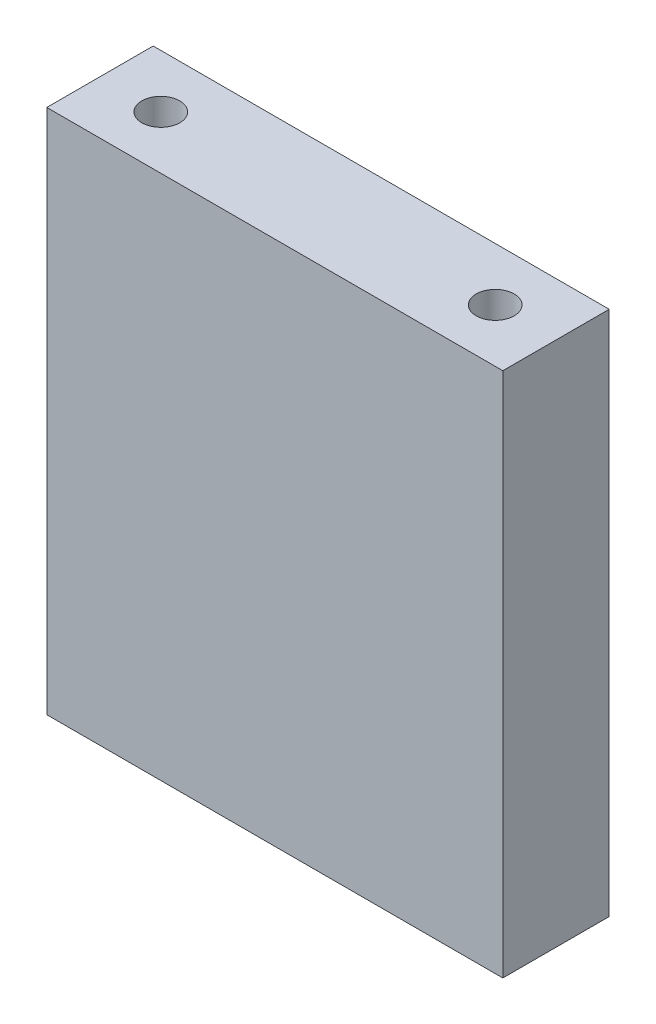
ISO-10303-21;
HEADER;
FILE_DESCRIPTION(('STEP AP214'),'2;1');
FILE_NAME('part.step','',(''),(''),'','','');
FILE_SCHEMA(('AUTOMOTIVE_DESIGN { 1 0 10303 214 1 1 1 1 }'));
ENDSEC;
DATA;
#1=APPLICATION_CONTEXT('core data for automotive mechanical design processes');
#2=APPLICATION_PROTOCOL_DEFINITION('international standard','automotive_design',2000,#1);
#3=PRODUCT_CONTEXT('',#1,'mechanical');
#4=PRODUCT('Part','Part','',(#3));
#5=PRODUCT_RELATED_PRODUCT_CATEGORY('part','',(#4));
#6=PRODUCT_DEFINITION_FORMATION('','',#4);
#7=PRODUCT_DEFINITION_CONTEXT('part definition',#1,'design');
#8=PRODUCT_DEFINITION('design','',#6,#7);
#9=PRODUCT_DEFINITION_SHAPE('','',#8);
#10=(LENGTH_UNIT() NAMED_UNIT(*) SI_UNIT(.MILLI.,.METRE.));
#11=(NAMED_UNIT(*) PLANE_ANGLE_UNIT() SI_UNIT($,.RADIAN.));
#12=(NAMED_UNIT(*) SI_UNIT($,.STERADIAN.) SOLID_ANGLE_UNIT());
#13=UNCERTAINTY_MEASURE_WITH_UNIT(LENGTH_MEASURE(1.E-05),#10,'distance_accuracy_value','');
#14=(GEOMETRIC_REPRESENTATION_CONTEXT(3) GLOBAL_UNCERTAINTY_ASSIGNED_CONTEXT((#13)) GLOBAL_UNIT_ASSIGNED_CONTEXT((#10,
#11,#12)) REPRESENTATION_CONTEXT('',''));
#15=CARTESIAN_POINT('',(0.,0.,0.));
#16=DIRECTION('',(0.,0.,1.));
#17=DIRECTION('',(1.,0.,0.));
#18=AXIS2_PLACEMENT_3D('',#15,#16,#17);
#19=CARTESIAN_POINT('',(0.,0.,7.));
#20=DIRECTION('',(1.,0.,0.));
#21=DIRECTION('',(0.,1.,0.));
#22=AXIS2_PLACEMENT_3D('',#19,#20,#21);
#23=PLANE('',#22);
#24=DIRECTION('',(0.,-1.,0.));
#25=VECTOR('',#24,1.);
#26=CARTESIAN_POINT('',(0.,0.,0.));
#27=LINE('',#26,#25);
#28=CARTESIAN_POINT('',(0.,34.6,0.));
#29=VERTEX_POINT('',#28);
#30=CARTESIAN_POINT('',(0.,0.,0.));
#31=VERTEX_POINT('',#30);
#32=EDGE_CURVE('E100',#29,#31,#27,.T.);
#33=ORIENTED_EDGE('',*,*,#32,.T.);
#34=DIRECTION('',(0.,0.,-1.));
#35=VECTOR('',#34,1.);
#36=CARTESIAN_POINT('',(0.,0.,7.));
#37=LINE('',#36,#35);
#38=CARTESIAN_POINT('',(0.,0.,7.));
#39=VERTEX_POINT('',#38);
#40=EDGE_CURVE('E11',#39,#31,#37,.T.);
#41=ORIENTED_EDGE('',*,*,#40,.F.);
#42=DIRECTION('',(0.,-1.,0.));
#43=VECTOR('',#42,1.);
#44=CARTESIAN_POINT('',(0.,0.,7.));
#45=LINE('',#44,#43);
#46=CARTESIAN_POINT('',(0.,34.6,7.));
#47=VERTEX_POINT('',#46);
#48=EDGE_CURVE('E88',#47,#39,#45,.T.);
#49=ORIENTED_EDGE('',*,*,#48,.F.);
#50=DIRECTION('',(0.,0.,-1.));
#51=VECTOR('',#50,1.);
#52=CARTESIAN_POINT('',(0.,34.6,7.));
#53=LINE('',#52,#51);
#54=EDGE_CURVE('E96',#47,#29,#53,.T.);
#55=ORIENTED_EDGE('',*,*,#54,.T.);
#56=EDGE_LOOP('',(#33,#41,#49,#55));
#57=FACE_BOUND('',#56,.T.);
#58=ADVANCED_FACE('F37',(#57),#23,.F.);
#59=CARTESIAN_POINT('',(0.,0.,7.));
#60=DIRECTION('',(0.,1.,0.));
#61=DIRECTION('',(0.,0.,1.));
#62=AXIS2_PLACEMENT_3D('',#59,#60,#61);
#63=PLANE('',#62);
#64=CARTESIAN_POINT('',(3.99999999999999,0.,3.5));
#65=DIRECTION('',(0.,1.,0.));
#66=DIRECTION('',(0.,0.,1.));
#67=AXIS2_PLACEMENT_3D('',#64,#65,#66);
#68=CIRCLE('',#67,1.25);
#69=CARTESIAN_POINT('',(3.99999999999999,0.,4.75));
#70=VERTEX_POINT('',#69);
#71=EDGE_CURVE('E103',#70,#70,#68,.T.);
#72=ORIENTED_EDGE('',*,*,#71,.T.);
#73=EDGE_LOOP('',(#72));
#74=FACE_BOUND('',#73,.T.);
#75=CARTESIAN_POINT('',(26.,0.,3.5));
#76=DIRECTION('',(0.,1.,0.));
#77=DIRECTION('',(0.,0.,1.));
#78=AXIS2_PLACEMENT_3D('',#75,#76,#77);
#79=CIRCLE('',#78,1.25);
#80=CARTESIAN_POINT('',(26.,0.,4.75));
#81=VERTEX_POINT('',#80);
#82=EDGE_CURVE('E117',#81,#81,#79,.T.);
#83=ORIENTED_EDGE('',*,*,#82,.T.);
#84=EDGE_LOOP('',(#83));
#85=FACE_BOUND('',#84,.T.);
#86=DIRECTION('',(1.,0.,0.));
#87=VECTOR('',#86,1.);
#88=CARTESIAN_POINT('',(0.,0.,0.));
#89=LINE('',#88,#87);
#90=CARTESIAN_POINT('',(30.,0.,0.));
#91=VERTEX_POINT('',#90);
#92=EDGE_CURVE('E92',#31,#91,#89,.T.);
#93=ORIENTED_EDGE('',*,*,#92,.T.);
#94=DIRECTION('',(0.,0.,-1.));
#95=VECTOR('',#94,1.);
#96=CARTESIAN_POINT('',(30.,0.,7.));
#97=LINE('',#96,#95);
#98=CARTESIAN_POINT('',(30.,0.,7.));
#99=VERTEX_POINT('',#98);
#100=EDGE_CURVE('E45',#99,#91,#97,.T.);
#101=ORIENTED_EDGE('',*,*,#100,.F.);
#102=DIRECTION('',(1.,0.,0.));
#103=VECTOR('',#102,1.);
#104=CARTESIAN_POINT('',(0.,0.,7.));
#105=LINE('',#104,#103);
#106=EDGE_CURVE('E83',#39,#99,#105,.T.);
#107=ORIENTED_EDGE('',*,*,#106,.F.);
#108=ORIENTED_EDGE('',*,*,#40,.T.);
#109=EDGE_LOOP('',(#93,#101,#107,#108));
#110=FACE_BOUND('',#109,.T.);
#111=ADVANCED_FACE('F91',(#74,#85,#110),#63,.F.);
#112=CARTESIAN_POINT('',(30.,0.,7.));
#113=DIRECTION('',(-1.,0.,0.));
#114=DIRECTION('',(0.,0.,1.));
#115=AXIS2_PLACEMENT_3D('',#112,#113,#114);
#116=PLANE('',#115);
#117=DIRECTION('',(0.,1.,0.));
#118=VECTOR('',#117,1.);
#119=CARTESIAN_POINT('',(30.,0.,0.));
#120=LINE('',#119,#118);
#121=CARTESIAN_POINT('',(30.,34.6,0.));
#122=VERTEX_POINT('',#121);
#123=EDGE_CURVE('E70',#91,#122,#120,.T.);
#124=ORIENTED_EDGE('',*,*,#123,.T.);
#125=DIRECTION('',(0.,0.,-1.));
#126=VECTOR('',#125,1.);
#127=CARTESIAN_POINT('',(30.,34.6,7.));
#128=LINE('',#127,#126);
#129=CARTESIAN_POINT('',(30.,34.6,7.));
#130=VERTEX_POINT('',#129);
#131=EDGE_CURVE('E93',#130,#122,#128,.T.);
#132=ORIENTED_EDGE('',*,*,#131,.F.);
#133=DIRECTION('',(0.,1.,0.));
#134=VECTOR('',#133,1.);
#135=CARTESIAN_POINT('',(30.,0.,7.));
#136=LINE('',#135,#134);
#137=EDGE_CURVE('E86',#99,#130,#136,.T.);
#138=ORIENTED_EDGE('',*,*,#137,.F.);
#139=ORIENTED_EDGE('',*,*,#100,.T.);
#140=EDGE_LOOP('',(#124,#132,#138,#139));
#141=FACE_BOUND('',#140,.T.);
#142=ADVANCED_FACE('F94',(#141),#116,.F.);
#143=CARTESIAN_POINT('',(0.,34.6,7.));
#144=DIRECTION('',(0.,-1.,0.));
#145=DIRECTION('',(0.,0.,-1.));
#146=AXIS2_PLACEMENT_3D('',#143,#144,#145);
#147=PLANE('',#146);
#148=CARTESIAN_POINT('',(3.99999999999999,34.6,3.5));
#149=DIRECTION('',(0.,1.,0.));
#150=DIRECTION('',(0.,0.,1.));
#151=AXIS2_PLACEMENT_3D('',#148,#149,#150);
#152=CIRCLE('',#151,1.25);
#153=CARTESIAN_POINT('',(3.99999999999999,34.6,4.75));
#154=VERTEX_POINT('',#153);
#155=EDGE_CURVE('E120',#154,#154,#152,.T.);
#156=ORIENTED_EDGE('',*,*,#155,.F.);
#157=EDGE_LOOP('',(#156));
#158=FACE_BOUND('',#157,.T.);
#159=CARTESIAN_POINT('',(26.,34.6,3.5));
#160=DIRECTION('',(0.,1.,0.));
#161=DIRECTION('',(0.,0.,1.));
#162=AXIS2_PLACEMENT_3D('',#159,#160,#161);
#163=CIRCLE('',#162,1.25);
#164=CARTESIAN_POINT('',(26.,34.6,4.75));
#165=VERTEX_POINT('',#164);
#166=EDGE_CURVE('E114',#165,#165,#163,.T.);
#167=ORIENTED_EDGE('',*,*,#166,.F.);
#168=EDGE_LOOP('',(#167));
#169=FACE_BOUND('',#168,.T.);
#170=DIRECTION('',(-1.,0.,0.));
#171=VECTOR('',#170,1.);
#172=CARTESIAN_POINT('',(0.,34.6,0.));
#173=LINE('',#172,#171);
#174=EDGE_CURVE('E76',#122,#29,#173,.T.);
#175=ORIENTED_EDGE('',*,*,#174,.T.);
#176=ORIENTED_EDGE('',*,*,#54,.F.);
#177=DIRECTION('',(-1.,0.,0.));
#178=VECTOR('',#177,1.);
#179=CARTESIAN_POINT('',(0.,34.6,7.));
#180=LINE('',#179,#178);
#181=EDGE_CURVE('E53',#130,#47,#180,.T.);
#182=ORIENTED_EDGE('',*,*,#181,.F.);
#183=ORIENTED_EDGE('',*,*,#131,.T.);
#184=EDGE_LOOP('',(#175,#176,#182,#183));
#185=FACE_BOUND('',#184,.T.);
#186=ADVANCED_FACE('F108',(#158,#169,#185),#147,.F.);
#187=CARTESIAN_POINT('',(0.,0.,7.));
#188=DIRECTION('',(0.,0.,-1.));
#189=DIRECTION('',(-1.,0.,0.));
#190=AXIS2_PLACEMENT_3D('',#187,#188,#189);
#191=PLANE('',#190);
#192=ORIENTED_EDGE('',*,*,#48,.T.);
#193=ORIENTED_EDGE('',*,*,#106,.T.);
#194=ORIENTED_EDGE('',*,*,#137,.T.);
#195=ORIENTED_EDGE('',*,*,#181,.T.);
#196=EDGE_LOOP('',(#192,#193,#194,#195));
#197=FACE_BOUND('',#196,.T.);
#198=ADVANCED_FACE('F84',(#197),#191,.F.);
#199=CARTESIAN_POINT('',(0.,0.,0.));
#200=DIRECTION('',(0.,0.,-1.));
#201=DIRECTION('',(-1.,0.,0.));
#202=AXIS2_PLACEMENT_3D('',#199,#200,#201);
#203=PLANE('',#202);
#204=ORIENTED_EDGE('',*,*,#32,.F.);
#205=ORIENTED_EDGE('',*,*,#174,.F.);
#206=ORIENTED_EDGE('',*,*,#123,.F.);
#207=ORIENTED_EDGE('',*,*,#92,.F.);
#208=EDGE_LOOP('',(#204,#205,#206,#207));
#209=FACE_BOUND('',#208,.T.);
#210=ADVANCED_FACE('F111',(#209),#203,.T.);
#211=CARTESIAN_POINT('',(26.,0.,3.5));
#212=DIRECTION('',(0.,1.,0.));
#213=DIRECTION('',(0.,0.,1.));
#214=AXIS2_PLACEMENT_3D('',#211,#212,#213);
#215=CYLINDRICAL_SURFACE('',#214,1.25);
#216=ORIENTED_EDGE('',*,*,#82,.F.);
#217=EDGE_LOOP('',(#216));
#218=FACE_BOUND('',#217,.T.);
#219=ORIENTED_EDGE('',*,*,#166,.T.);
#220=EDGE_LOOP('',(#219));
#221=FACE_BOUND('',#220,.T.);
#222=ADVANCED_FACE('F131',(#218,#221),#215,.F.);
#223=CARTESIAN_POINT('',(3.99999999999999,0.,3.5));
#224=DIRECTION('',(0.,1.,0.));
#225=DIRECTION('',(0.,0.,1.));
#226=AXIS2_PLACEMENT_3D('',#223,#224,#225);
#227=CYLINDRICAL_SURFACE('',#226,1.25);
#228=ORIENTED_EDGE('',*,*,#71,.F.);
#229=EDGE_LOOP('',(#228));
#230=FACE_BOUND('',#229,.T.);
#231=ORIENTED_EDGE('',*,*,#155,.T.);
#232=EDGE_LOOP('',(#231));
#233=FACE_BOUND('',#232,.T.);
#234=ADVANCED_FACE('F128',(#230,#233),#227,.F.);
#235=CLOSED_SHELL('',(#58,#111,#142,#186,#198,#210,#222,#234));
#236=MANIFOLD_SOLID_BREP('B2',#235);
#237=ADVANCED_BREP_SHAPE_REPRESENTATION('',(#18,#236),#14);
#238=SHAPE_DEFINITION_REPRESENTATION(#9,#237);
ENDSEC;
END-ISO-10303-21;
